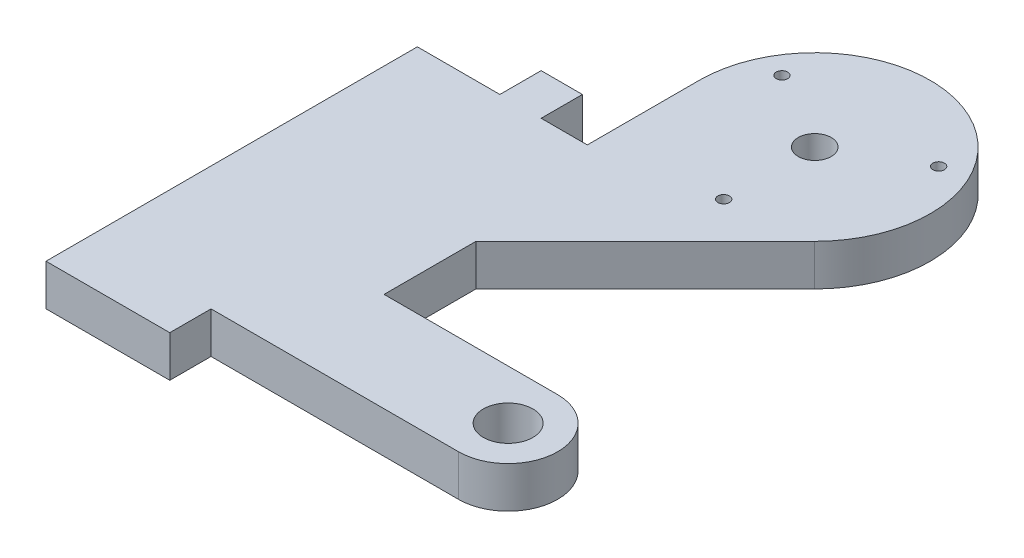
ISO-10303-21;
HEADER;
FILE_DESCRIPTION(('STEP AP214'),'2;1');
FILE_NAME('part.step','',(''),(''),'','','');
FILE_SCHEMA(('AUTOMOTIVE_DESIGN { 1 0 10303 214 1 1 1 1 }'));
ENDSEC;
DATA;
#1=APPLICATION_CONTEXT('core data for automotive mechanical design processes');
#2=APPLICATION_PROTOCOL_DEFINITION('international standard','automotive_design',2000,#1);
#3=PRODUCT_CONTEXT('',#1,'mechanical');
#4=PRODUCT('Part','Part','',(#3));
#5=PRODUCT_RELATED_PRODUCT_CATEGORY('part','',(#4));
#6=PRODUCT_DEFINITION_FORMATION('','',#4);
#7=PRODUCT_DEFINITION_CONTEXT('part definition',#1,'design');
#8=PRODUCT_DEFINITION('design','',#6,#7);
#9=PRODUCT_DEFINITION_SHAPE('','',#8);
#10=(LENGTH_UNIT() NAMED_UNIT(*) SI_UNIT(.MILLI.,.METRE.));
#11=(NAMED_UNIT(*) PLANE_ANGLE_UNIT() SI_UNIT($,.RADIAN.));
#12=(NAMED_UNIT(*) SI_UNIT($,.STERADIAN.) SOLID_ANGLE_UNIT());
#13=UNCERTAINTY_MEASURE_WITH_UNIT(LENGTH_MEASURE(1.E-05),#10,'distance_accuracy_value','');
#14=(GEOMETRIC_REPRESENTATION_CONTEXT(3) GLOBAL_UNCERTAINTY_ASSIGNED_CONTEXT((#13)) GLOBAL_UNIT_ASSIGNED_CONTEXT((#10,
#11,#12)) REPRESENTATION_CONTEXT('',''));
#15=CARTESIAN_POINT('',(0.,0.,0.));
#16=DIRECTION('',(0.,0.,1.));
#17=DIRECTION('',(1.,0.,0.));
#18=AXIS2_PLACEMENT_3D('',#15,#16,#17);
#19=CARTESIAN_POINT('',(34.5943867597462,5.,-53.5625469181819));
#20=DIRECTION('',(0.,-1.,0.));
#21=DIRECTION('',(0.,0.,-1.));
#22=AXIS2_PLACEMENT_3D('',#19,#20,#21);
#23=CYLINDRICAL_SURFACE('',#22,14.);
#24=CARTESIAN_POINT('',(34.5943867597462,0.,-53.5625469181819));
#25=DIRECTION('',(0.,1.,0.));
#26=DIRECTION('',(0.,0.,1.));
#27=AXIS2_PLACEMENT_3D('',#24,#25,#26);
#28=CIRCLE('',#27,14.);
#29=CARTESIAN_POINT('',(44.4938816963578,0.,-43.6630519815702));
#30=VERTEX_POINT('',#29);
#31=CARTESIAN_POINT('',(20.5943867597462,0.,-53.5625469181819));
#32=VERTEX_POINT('',#31);
#33=EDGE_CURVE('E207',#30,#32,#28,.T.);
#34=ORIENTED_EDGE('',*,*,#33,.T.);
#35=DIRECTION('',(0.,-1.,0.));
#36=VECTOR('',#35,1.);
#37=CARTESIAN_POINT('',(20.5943867597462,5.,-53.5625469181819));
#38=LINE('',#37,#36);
#39=CARTESIAN_POINT('',(20.5943867597462,5.,-53.5625469181819));
#40=VERTEX_POINT('',#39);
#41=EDGE_CURVE('E11',#40,#32,#38,.T.);
#42=ORIENTED_EDGE('',*,*,#41,.F.);
#43=CARTESIAN_POINT('',(34.5943867597462,5.,-53.5625469181819));
#44=DIRECTION('',(0.,1.,0.));
#45=DIRECTION('',(0.,0.,1.));
#46=AXIS2_PLACEMENT_3D('',#43,#44,#45);
#47=CIRCLE('',#46,14.);
#48=CARTESIAN_POINT('',(44.4938816963578,5.,-43.6630519815702));
#49=VERTEX_POINT('',#48);
#50=EDGE_CURVE('E353',#49,#40,#47,.T.);
#51=ORIENTED_EDGE('',*,*,#50,.F.);
#52=DIRECTION('',(0.,-1.,0.));
#53=VECTOR('',#52,1.);
#54=CARTESIAN_POINT('',(44.4938816963578,5.,-43.6630519815702));
#55=LINE('',#54,#53);
#56=EDGE_CURVE('E59',#49,#30,#55,.T.);
#57=ORIENTED_EDGE('',*,*,#56,.T.);
#58=EDGE_LOOP('',(#34,#42,#51,#57));
#59=FACE_BOUND('',#58,.T.);
#60=ADVANCED_FACE('F41',(#59),#23,.T.);
#61=CARTESIAN_POINT('',(20.5943867597462,5.,0.));
#62=DIRECTION('',(1.,0.,0.));
#63=DIRECTION('',(0.,0.,-1.));
#64=AXIS2_PLACEMENT_3D('',#61,#62,#63);
#65=PLANE('',#64);
#66=DIRECTION('',(0.,0.,1.));
#67=VECTOR('',#66,1.);
#68=CARTESIAN_POINT('',(20.5943867597462,0.,0.));
#69=LINE('',#68,#67);
#70=CARTESIAN_POINT('',(20.5943867597462,0.,-40.));
#71=VERTEX_POINT('',#70);
#72=EDGE_CURVE('E210',#32,#71,#69,.T.);
#73=ORIENTED_EDGE('',*,*,#72,.T.);
#74=DIRECTION('',(0.,-1.,0.));
#75=VECTOR('',#74,1.);
#76=CARTESIAN_POINT('',(20.5943867597462,5.,-40.));
#77=LINE('',#76,#75);
#78=CARTESIAN_POINT('',(20.5943867597462,5.,-40.));
#79=VERTEX_POINT('',#78);
#80=EDGE_CURVE('E51',#79,#71,#77,.T.);
#81=ORIENTED_EDGE('',*,*,#80,.F.);
#82=DIRECTION('',(0.,0.,1.));
#83=VECTOR('',#82,1.);
#84=CARTESIAN_POINT('',(20.5943867597462,5.,0.));
#85=LINE('',#84,#83);
#86=EDGE_CURVE('E119',#40,#79,#85,.T.);
#87=ORIENTED_EDGE('',*,*,#86,.F.);
#88=ORIENTED_EDGE('',*,*,#41,.T.);
#89=EDGE_LOOP('',(#73,#81,#87,#88));
#90=FACE_BOUND('',#89,.T.);
#91=ADVANCED_FACE('F303',(#90),#65,.F.);
#92=CARTESIAN_POINT('',(0.,5.,-40.));
#93=DIRECTION('',(0.,0.,-1.));
#94=DIRECTION('',(-1.,0.,0.));
#95=AXIS2_PLACEMENT_3D('',#92,#93,#94);
#96=PLANE('',#95);
#97=DIRECTION('',(1.,0.,0.));
#98=VECTOR('',#97,1.);
#99=CARTESIAN_POINT('',(0.,0.,-40.));
#100=LINE('',#99,#98);
#101=CARTESIAN_POINT('',(15.,0.,-40.));
#102=VERTEX_POINT('',#101);
#103=EDGE_CURVE('E214',#102,#71,#100,.T.);
#104=ORIENTED_EDGE('',*,*,#103,.F.);
#105=DIRECTION('',(0.,-1.,0.));
#106=VECTOR('',#105,1.);
#107=CARTESIAN_POINT('',(15.,5.,-40.));
#108=LINE('',#107,#106);
#109=CARTESIAN_POINT('',(15.,5.,-40.));
#110=VERTEX_POINT('',#109);
#111=EDGE_CURVE('E294',#110,#102,#108,.T.);
#112=ORIENTED_EDGE('',*,*,#111,.F.);
#113=DIRECTION('',(1.,0.,0.));
#114=VECTOR('',#113,1.);
#115=CARTESIAN_POINT('',(0.,5.,-40.));
#116=LINE('',#115,#114);
#117=EDGE_CURVE('E302',#110,#79,#116,.T.);
#118=ORIENTED_EDGE('',*,*,#117,.T.);
#119=ORIENTED_EDGE('',*,*,#80,.T.);
#120=EDGE_LOOP('',(#104,#112,#118,#119));
#121=FACE_BOUND('',#120,.T.);
#122=ADVANCED_FACE('F300',(#121),#96,.T.);
#123=CARTESIAN_POINT('',(15.,5.,0.));
#124=DIRECTION('',(-1.,0.,0.));
#125=DIRECTION('',(0.,0.,1.));
#126=AXIS2_PLACEMENT_3D('',#123,#124,#125);
#127=PLANE('',#126);
#128=DIRECTION('',(0.,0.,-1.));
#129=VECTOR('',#128,1.);
#130=CARTESIAN_POINT('',(15.,0.,0.));
#131=LINE('',#130,#129);
#132=CARTESIAN_POINT('',(15.,0.,-45.));
#133=VERTEX_POINT('',#132);
#134=EDGE_CURVE('E218',#102,#133,#131,.T.);
#135=ORIENTED_EDGE('',*,*,#134,.T.);
#136=DIRECTION('',(0.,-1.,0.));
#137=VECTOR('',#136,1.);
#138=CARTESIAN_POINT('',(15.,5.,-45.));
#139=LINE('',#138,#137);
#140=CARTESIAN_POINT('',(15.,5.,-45.));
#141=VERTEX_POINT('',#140);
#142=EDGE_CURVE('E290',#141,#133,#139,.T.);
#143=ORIENTED_EDGE('',*,*,#142,.F.);
#144=DIRECTION('',(0.,0.,-1.));
#145=VECTOR('',#144,1.);
#146=CARTESIAN_POINT('',(15.,5.,0.));
#147=LINE('',#146,#145);
#148=EDGE_CURVE('E323',#110,#141,#147,.T.);
#149=ORIENTED_EDGE('',*,*,#148,.F.);
#150=ORIENTED_EDGE('',*,*,#111,.T.);
#151=EDGE_LOOP('',(#135,#143,#149,#150));
#152=FACE_BOUND('',#151,.T.);
#153=ADVANCED_FACE('F312',(#152),#127,.F.);
#154=CARTESIAN_POINT('',(0.,5.,-45.));
#155=DIRECTION('',(0.,0.,1.));
#156=DIRECTION('',(1.,0.,0.));
#157=AXIS2_PLACEMENT_3D('',#154,#155,#156);
#158=PLANE('',#157);
#159=DIRECTION('',(-1.,0.,0.));
#160=VECTOR('',#159,1.);
#161=CARTESIAN_POINT('',(0.,0.,-45.));
#162=LINE('',#161,#160);
#163=CARTESIAN_POINT('',(9.99999999999999,0.,-45.));
#164=VERTEX_POINT('',#163);
#165=EDGE_CURVE('E222',#133,#164,#162,.T.);
#166=ORIENTED_EDGE('',*,*,#165,.T.);
#167=DIRECTION('',(0.,-1.,0.));
#168=VECTOR('',#167,1.);
#169=CARTESIAN_POINT('',(9.99999999999999,5.,-45.));
#170=LINE('',#169,#168);
#171=CARTESIAN_POINT('',(9.99999999999999,5.,-45.));
#172=VERTEX_POINT('',#171);
#173=EDGE_CURVE('E287',#172,#164,#170,.T.);
#174=ORIENTED_EDGE('',*,*,#173,.F.);
#175=DIRECTION('',(-1.,0.,0.));
#176=VECTOR('',#175,1.);
#177=CARTESIAN_POINT('',(0.,5.,-45.));
#178=LINE('',#177,#176);
#179=EDGE_CURVE('E318',#141,#172,#178,.T.);
#180=ORIENTED_EDGE('',*,*,#179,.F.);
#181=ORIENTED_EDGE('',*,*,#142,.T.);
#182=EDGE_LOOP('',(#166,#174,#180,#181));
#183=FACE_BOUND('',#182,.T.);
#184=ADVANCED_FACE('F316',(#183),#158,.F.);
#185=CARTESIAN_POINT('',(10.,5.,0.));
#186=DIRECTION('',(-1.,0.,0.));
#187=DIRECTION('',(0.,0.,1.));
#188=AXIS2_PLACEMENT_3D('',#185,#186,#187);
#189=PLANE('',#188);
#190=DIRECTION('',(0.,0.,-1.));
#191=VECTOR('',#190,1.);
#192=CARTESIAN_POINT('',(10.,0.,0.));
#193=LINE('',#192,#191);
#194=CARTESIAN_POINT('',(10.,0.,-40.));
#195=VERTEX_POINT('',#194);
#196=EDGE_CURVE('E226',#195,#164,#193,.T.);
#197=ORIENTED_EDGE('',*,*,#196,.F.);
#198=DIRECTION('',(0.,-1.,0.));
#199=VECTOR('',#198,1.);
#200=CARTESIAN_POINT('',(10.,5.,-40.));
#201=LINE('',#200,#199);
#202=CARTESIAN_POINT('',(10.,5.,-40.));
#203=VERTEX_POINT('',#202);
#204=EDGE_CURVE('E284',#203,#195,#201,.T.);
#205=ORIENTED_EDGE('',*,*,#204,.F.);
#206=DIRECTION('',(0.,0.,-1.));
#207=VECTOR('',#206,1.);
#208=CARTESIAN_POINT('',(10.,5.,0.));
#209=LINE('',#208,#207);
#210=EDGE_CURVE('E322',#203,#172,#209,.T.);
#211=ORIENTED_EDGE('',*,*,#210,.T.);
#212=ORIENTED_EDGE('',*,*,#173,.T.);
#213=EDGE_LOOP('',(#197,#205,#211,#212));
#214=FACE_BOUND('',#213,.T.);
#215=ADVANCED_FACE('F458',(#214),#189,.T.);
#216=CARTESIAN_POINT('',(0.,0.,-40.));
#217=VERTEX_POINT('',#216);
#218=EDGE_CURVE('E219',#217,#195,#100,.T.);
#219=ORIENTED_EDGE('',*,*,#218,.F.);
#220=DIRECTION('',(0.,-1.,0.));
#221=VECTOR('',#220,1.);
#222=CARTESIAN_POINT('',(0.,5.,-40.));
#223=LINE('',#222,#221);
#224=CARTESIAN_POINT('',(0.,5.,-40.));
#225=VERTEX_POINT('',#224);
#226=EDGE_CURVE('E281',#225,#217,#223,.T.);
#227=ORIENTED_EDGE('',*,*,#226,.F.);
#228=EDGE_CURVE('E327',#225,#203,#116,.T.);
#229=ORIENTED_EDGE('',*,*,#228,.T.);
#230=ORIENTED_EDGE('',*,*,#204,.T.);
#231=EDGE_LOOP('',(#219,#227,#229,#230));
#232=FACE_BOUND('',#231,.T.);
#233=ADVANCED_FACE('F454',(#232),#96,.T.);
#234=CARTESIAN_POINT('',(0.,5.,0.));
#235=DIRECTION('',(-1.,0.,0.));
#236=DIRECTION('',(0.,0.,1.));
#237=AXIS2_PLACEMENT_3D('',#234,#235,#236);
#238=PLANE('',#237);
#239=DIRECTION('',(0.,0.,-1.));
#240=VECTOR('',#239,1.);
#241=CARTESIAN_POINT('',(0.,0.,0.));
#242=LINE('',#241,#240);
#243=CARTESIAN_POINT('',(0.,0.,5.));
#244=VERTEX_POINT('',#243);
#245=EDGE_CURVE('E230',#244,#217,#242,.T.);
#246=ORIENTED_EDGE('',*,*,#245,.F.);
#247=DIRECTION('',(0.,-1.,0.));
#248=VECTOR('',#247,1.);
#249=CARTESIAN_POINT('',(0.,5.,5.));
#250=LINE('',#249,#248);
#251=CARTESIAN_POINT('',(0.,5.,5.));
#252=VERTEX_POINT('',#251);
#253=EDGE_CURVE('E278',#252,#244,#250,.T.);
#254=ORIENTED_EDGE('',*,*,#253,.F.);
#255=DIRECTION('',(0.,0.,-1.));
#256=VECTOR('',#255,1.);
#257=CARTESIAN_POINT('',(0.,5.,0.));
#258=LINE('',#257,#256);
#259=EDGE_CURVE('E332',#252,#225,#258,.T.);
#260=ORIENTED_EDGE('',*,*,#259,.T.);
#261=ORIENTED_EDGE('',*,*,#226,.T.);
#262=EDGE_LOOP('',(#246,#254,#260,#261));
#263=FACE_BOUND('',#262,.T.);
#264=ADVANCED_FACE('F450',(#263),#238,.T.);
#265=CARTESIAN_POINT('',(0.,5.,5.));
#266=DIRECTION('',(0.,0.,-1.));
#267=DIRECTION('',(-1.,0.,0.));
#268=AXIS2_PLACEMENT_3D('',#265,#266,#267);
#269=PLANE('',#268);
#270=DIRECTION('',(1.,0.,0.));
#271=VECTOR('',#270,1.);
#272=CARTESIAN_POINT('',(0.,0.,5.));
#273=LINE('',#272,#271);
#274=CARTESIAN_POINT('',(15.,0.,5.));
#275=VERTEX_POINT('',#274);
#276=EDGE_CURVE('E234',#244,#275,#273,.T.);
#277=ORIENTED_EDGE('',*,*,#276,.T.);
#278=DIRECTION('',(0.,-1.,0.));
#279=VECTOR('',#278,1.);
#280=CARTESIAN_POINT('',(15.,5.,5.));
#281=LINE('',#280,#279);
#282=CARTESIAN_POINT('',(15.,5.,5.));
#283=VERTEX_POINT('',#282);
#284=EDGE_CURVE('E275',#283,#275,#281,.T.);
#285=ORIENTED_EDGE('',*,*,#284,.F.);
#286=DIRECTION('',(1.,0.,0.));
#287=VECTOR('',#286,1.);
#288=CARTESIAN_POINT('',(0.,5.,5.));
#289=LINE('',#288,#287);
#290=EDGE_CURVE('E336',#252,#283,#289,.T.);
#291=ORIENTED_EDGE('',*,*,#290,.F.);
#292=ORIENTED_EDGE('',*,*,#253,.T.);
#293=EDGE_LOOP('',(#277,#285,#291,#292));
#294=FACE_BOUND('',#293,.T.);
#295=ADVANCED_FACE('F446',(#294),#269,.F.);
#296=CARTESIAN_POINT('',(15.,5.,0.));
#297=DIRECTION('',(1.,0.,0.));
#298=DIRECTION('',(0.,0.,-1.));
#299=AXIS2_PLACEMENT_3D('',#296,#297,#298);
#300=PLANE('',#299);
#301=DIRECTION('',(0.,0.,1.));
#302=VECTOR('',#301,1.);
#303=CARTESIAN_POINT('',(15.,0.,0.));
#304=LINE('',#303,#302);
#305=CARTESIAN_POINT('',(15.,0.,0.));
#306=VERTEX_POINT('',#305);
#307=EDGE_CURVE('E238',#306,#275,#304,.T.);
#308=ORIENTED_EDGE('',*,*,#307,.F.);
#309=DIRECTION('',(0.,-1.,0.));
#310=VECTOR('',#309,1.);
#311=CARTESIAN_POINT('',(15.,5.,0.));
#312=LINE('',#311,#310);
#313=CARTESIAN_POINT('',(15.,5.,0.));
#314=VERTEX_POINT('',#313);
#315=EDGE_CURVE('E272',#314,#306,#312,.T.);
#316=ORIENTED_EDGE('',*,*,#315,.F.);
#317=DIRECTION('',(0.,0.,1.));
#318=VECTOR('',#317,1.);
#319=CARTESIAN_POINT('',(15.,5.,0.));
#320=LINE('',#319,#318);
#321=EDGE_CURVE('E339',#314,#283,#320,.T.);
#322=ORIENTED_EDGE('',*,*,#321,.T.);
#323=ORIENTED_EDGE('',*,*,#284,.T.);
#324=EDGE_LOOP('',(#308,#316,#322,#323));
#325=FACE_BOUND('',#324,.T.);
#326=ADVANCED_FACE('F442',(#325),#300,.T.);
#327=CARTESIAN_POINT('',(0.,5.,0.));
#328=DIRECTION('',(0.,0.,-1.));
#329=DIRECTION('',(-1.,0.,0.));
#330=AXIS2_PLACEMENT_3D('',#327,#328,#329);
#331=PLANE('',#330);
#332=DIRECTION('',(1.,0.,0.));
#333=VECTOR('',#332,1.);
#334=CARTESIAN_POINT('',(0.,0.,0.));
#335=LINE('',#334,#333);
#336=CARTESIAN_POINT('',(45.,0.,0.));
#337=VERTEX_POINT('',#336);
#338=EDGE_CURVE('E242',#306,#337,#335,.T.);
#339=ORIENTED_EDGE('',*,*,#338,.T.);
#340=DIRECTION('',(0.,-1.,0.));
#341=VECTOR('',#340,1.);
#342=CARTESIAN_POINT('',(45.,5.,0.));
#343=LINE('',#342,#341);
#344=CARTESIAN_POINT('',(45.,5.,0.));
#345=VERTEX_POINT('',#344);
#346=EDGE_CURVE('E268',#345,#337,#343,.T.);
#347=ORIENTED_EDGE('',*,*,#346,.F.);
#348=DIRECTION('',(1.,0.,0.));
#349=VECTOR('',#348,1.);
#350=CARTESIAN_POINT('',(0.,5.,0.));
#351=LINE('',#350,#349);
#352=EDGE_CURVE('E343',#314,#345,#351,.T.);
#353=ORIENTED_EDGE('',*,*,#352,.F.);
#354=ORIENTED_EDGE('',*,*,#315,.T.);
#355=EDGE_LOOP('',(#339,#347,#353,#354));
#356=FACE_BOUND('',#355,.T.);
#357=ADVANCED_FACE('F438',(#356),#331,.F.);
#358=CARTESIAN_POINT('',(45.,5.,-6.));
#359=DIRECTION('',(0.,-1.,0.));
#360=DIRECTION('',(0.,0.,-1.));
#361=AXIS2_PLACEMENT_3D('',#358,#359,#360);
#362=CYLINDRICAL_SURFACE('',#361,6.);
#363=CARTESIAN_POINT('',(45.,0.,-6.));
#364=DIRECTION('',(0.,1.,0.));
#365=DIRECTION('',(0.,0.,1.));
#366=AXIS2_PLACEMENT_3D('',#363,#364,#365);
#367=CIRCLE('',#366,6.);
#368=CARTESIAN_POINT('',(45.,0.,-12.));
#369=VERTEX_POINT('',#368);
#370=EDGE_CURVE('E245',#337,#369,#367,.T.);
#371=ORIENTED_EDGE('',*,*,#370,.T.);
#372=DIRECTION('',(0.,-1.,0.));
#373=VECTOR('',#372,1.);
#374=CARTESIAN_POINT('',(45.,5.,-12.));
#375=LINE('',#374,#373);
#376=CARTESIAN_POINT('',(45.,5.,-12.));
#377=VERTEX_POINT('',#376);
#378=EDGE_CURVE('E177',#377,#369,#375,.T.);
#379=ORIENTED_EDGE('',*,*,#378,.F.);
#380=CARTESIAN_POINT('',(45.,5.,-6.));
#381=DIRECTION('',(0.,1.,0.));
#382=DIRECTION('',(0.,0.,1.));
#383=AXIS2_PLACEMENT_3D('',#380,#381,#382);
#384=CIRCLE('',#383,6.);
#385=EDGE_CURVE('E163',#345,#377,#384,.T.);
#386=ORIENTED_EDGE('',*,*,#385,.F.);
#387=ORIENTED_EDGE('',*,*,#346,.T.);
#388=EDGE_LOOP('',(#371,#379,#386,#387));
#389=FACE_BOUND('',#388,.T.);
#390=ADVANCED_FACE('F435',(#389),#362,.T.);
#391=CARTESIAN_POINT('',(0.,5.,-12.));
#392=DIRECTION('',(0.,0.,1.));
#393=DIRECTION('',(1.,0.,0.));
#394=AXIS2_PLACEMENT_3D('',#391,#392,#393);
#395=PLANE('',#394);
#396=DIRECTION('',(-1.,0.,0.));
#397=VECTOR('',#396,1.);
#398=CARTESIAN_POINT('',(0.,0.,-12.));
#399=LINE('',#398,#397);
#400=CARTESIAN_POINT('',(23.9647394168679,0.,-12.));
#401=VERTEX_POINT('',#400);
#402=EDGE_CURVE('E173',#369,#401,#399,.T.);
#403=ORIENTED_EDGE('',*,*,#402,.T.);
#404=DIRECTION('',(0.,-1.,0.));
#405=VECTOR('',#404,1.);
#406=CARTESIAN_POINT('',(23.9647394168679,5.,-12.));
#407=LINE('',#406,#405);
#408=CARTESIAN_POINT('',(23.9647394168679,5.,-12.));
#409=VERTEX_POINT('',#408);
#410=EDGE_CURVE('E170',#409,#401,#407,.T.);
#411=ORIENTED_EDGE('',*,*,#410,.F.);
#412=DIRECTION('',(-1.,0.,0.));
#413=VECTOR('',#412,1.);
#414=CARTESIAN_POINT('',(0.,5.,-12.));
#415=LINE('',#414,#413);
#416=EDGE_CURVE('E155',#377,#409,#415,.T.);
#417=ORIENTED_EDGE('',*,*,#416,.F.);
#418=ORIENTED_EDGE('',*,*,#378,.T.);
#419=EDGE_LOOP('',(#403,#411,#417,#418));
#420=FACE_BOUND('',#419,.T.);
#421=ADVANCED_FACE('F171',(#420),#395,.F.);
#422=CARTESIAN_POINT('',(23.9647394168679,5.,0.));
#423=DIRECTION('',(-1.,0.,0.));
#424=DIRECTION('',(0.,0.,1.));
#425=AXIS2_PLACEMENT_3D('',#422,#423,#424);
#426=PLANE('',#425);
#427=DIRECTION('',(0.,0.,-1.));
#428=VECTOR('',#427,1.);
#429=CARTESIAN_POINT('',(23.9647394168679,0.,0.));
#430=LINE('',#429,#428);
#431=CARTESIAN_POINT('',(23.9647394168679,0.,-23.1339097020804));
#432=VERTEX_POINT('',#431);
#433=EDGE_CURVE('E250',#401,#432,#430,.T.);
#434=ORIENTED_EDGE('',*,*,#433,.T.);
#435=DIRECTION('',(0.,-1.,0.));
#436=VECTOR('',#435,1.);
#437=CARTESIAN_POINT('',(23.9647394168679,5.,-23.1339097020804));
#438=LINE('',#437,#436);
#439=CARTESIAN_POINT('',(23.9647394168679,5.,-23.1339097020804));
#440=VERTEX_POINT('',#439);
#441=EDGE_CURVE('E107',#440,#432,#438,.T.);
#442=ORIENTED_EDGE('',*,*,#441,.F.);
#443=DIRECTION('',(0.,0.,-1.));
#444=VECTOR('',#443,1.);
#445=CARTESIAN_POINT('',(23.9647394168679,5.,0.));
#446=LINE('',#445,#444);
#447=EDGE_CURVE('E161',#409,#440,#446,.T.);
#448=ORIENTED_EDGE('',*,*,#447,.F.);
#449=ORIENTED_EDGE('',*,*,#410,.T.);
#450=EDGE_LOOP('',(#434,#442,#448,#449));
#451=FACE_BOUND('',#450,.T.);
#452=ADVANCED_FACE('F179',(#451),#426,.F.);
#453=CARTESIAN_POINT('',(0.415414857393735,5.,0.415414857393736));
#454=DIRECTION('',(0.707106781186546,0.,0.707106781186549));
#455=DIRECTION('',(0.707106781186549,0.,-0.707106781186546));
#456=AXIS2_PLACEMENT_3D('',#453,#454,#455);
#457=PLANE('',#456);
#458=DIRECTION('',(-0.707106781186549,0.,0.707106781186546));
#459=VECTOR('',#458,1.);
#460=CARTESIAN_POINT('',(0.415414857393735,0.,0.415414857393736));
#461=LINE('',#460,#459);
#462=EDGE_CURVE('E253',#30,#432,#461,.T.);
#463=ORIENTED_EDGE('',*,*,#462,.F.);
#464=ORIENTED_EDGE('',*,*,#56,.F.);
#465=DIRECTION('',(-0.707106781186549,0.,0.707106781186546));
#466=VECTOR('',#465,1.);
#467=CARTESIAN_POINT('',(0.415414857393735,5.,0.415414857393736));
#468=LINE('',#467,#466);
#469=EDGE_CURVE('E181',#49,#440,#468,.T.);
#470=ORIENTED_EDGE('',*,*,#469,.T.);
#471=ORIENTED_EDGE('',*,*,#441,.T.);
#472=EDGE_LOOP('',(#463,#464,#470,#471));
#473=FACE_BOUND('',#472,.T.);
#474=ADVANCED_FACE('F389',(#473),#457,.T.);
#475=CARTESIAN_POINT('',(44.1390993033221,5.,-59.0304955701449));
#476=DIRECTION('',(0.,-1.,0.));
#477=DIRECTION('',(0.,0.,-1.));
#478=AXIS2_PLACEMENT_3D('',#475,#476,#477);
#479=CYLINDRICAL_SURFACE('',#478,0.700000000000006);
#480=CARTESIAN_POINT('',(44.1390993033221,5.,-59.0304955701449));
#481=DIRECTION('',(0.,1.,0.));
#482=DIRECTION('',(0.,0.,1.));
#483=AXIS2_PLACEMENT_3D('',#480,#481,#482);
#484=CIRCLE('',#483,0.700000000000006);
#485=CARTESIAN_POINT('',(44.1390993033221,5.,-58.3304955701449));
#486=VERTEX_POINT('',#485);
#487=EDGE_CURVE('E355',#486,#486,#484,.T.);
#488=ORIENTED_EDGE('',*,*,#487,.T.);
#489=EDGE_LOOP('',(#488));
#490=FACE_BOUND('',#489,.T.);
#491=CARTESIAN_POINT('',(44.1390993033221,0.,-59.0304955701449));
#492=DIRECTION('',(0.,1.,0.));
#493=DIRECTION('',(0.,0.,1.));
#494=AXIS2_PLACEMENT_3D('',#491,#492,#493);
#495=CIRCLE('',#494,0.700000000000006);
#496=CARTESIAN_POINT('',(44.1390993033221,0.,-58.3304955701449));
#497=VERTEX_POINT('',#496);
#498=EDGE_CURVE('E203',#497,#497,#495,.T.);
#499=ORIENTED_EDGE('',*,*,#498,.F.);
#500=EDGE_LOOP('',(#499));
#501=FACE_BOUND('',#500,.T.);
#502=ADVANCED_FACE('F385',(#490,#501),#479,.F.);
#503=CARTESIAN_POINT('',(25.0866480487693,5.,-59.0945361267571));
#504=DIRECTION('',(0.,-1.,0.));
#505=DIRECTION('',(0.,0.,-1.));
#506=AXIS2_PLACEMENT_3D('',#503,#504,#505);
#507=CYLINDRICAL_SURFACE('',#506,0.700000000000004);
#508=CARTESIAN_POINT('',(25.0866480487693,5.,-59.0945361267571));
#509=DIRECTION('',(0.,1.,0.));
#510=DIRECTION('',(0.,0.,1.));
#511=AXIS2_PLACEMENT_3D('',#508,#509,#510);
#512=CIRCLE('',#511,0.700000000000004);
#513=CARTESIAN_POINT('',(25.0866480487693,5.,-58.3945361267571));
#514=VERTEX_POINT('',#513);
#515=EDGE_CURVE('E361',#514,#514,#512,.T.);
#516=ORIENTED_EDGE('',*,*,#515,.T.);
#517=EDGE_LOOP('',(#516));
#518=FACE_BOUND('',#517,.T.);
#519=CARTESIAN_POINT('',(25.0866480487693,0.,-59.0945361267571));
#520=DIRECTION('',(0.,1.,0.));
#521=DIRECTION('',(0.,0.,1.));
#522=AXIS2_PLACEMENT_3D('',#519,#520,#521);
#523=CIRCLE('',#522,0.700000000000004);
#524=CARTESIAN_POINT('',(25.0866480487693,0.,-58.3945361267571));
#525=VERTEX_POINT('',#524);
#526=EDGE_CURVE('E199',#525,#525,#523,.T.);
#527=ORIENTED_EDGE('',*,*,#526,.F.);
#528=EDGE_LOOP('',(#527));
#529=FACE_BOUND('',#528,.T.);
#530=ADVANCED_FACE('F388',(#518,#529),#507,.F.);
#531=CARTESIAN_POINT('',(34.5574129271471,5.,-42.5626090576436));
#532=DIRECTION('',(0.,-1.,0.));
#533=DIRECTION('',(0.,0.,-1.));
#534=AXIS2_PLACEMENT_3D('',#531,#532,#533);
#535=CYLINDRICAL_SURFACE('',#534,0.700000000000001);
#536=CARTESIAN_POINT('',(34.5574129271471,5.,-42.5626090576436));
#537=DIRECTION('',(0.,1.,0.));
#538=DIRECTION('',(0.,0.,1.));
#539=AXIS2_PLACEMENT_3D('',#536,#537,#538);
#540=CIRCLE('',#539,0.700000000000001);
#541=CARTESIAN_POINT('',(34.5574129271471,5.,-41.8626090576436));
#542=VERTEX_POINT('',#541);
#543=EDGE_CURVE('E365',#542,#542,#540,.T.);
#544=ORIENTED_EDGE('',*,*,#543,.T.);
#545=EDGE_LOOP('',(#544));
#546=FACE_BOUND('',#545,.T.);
#547=CARTESIAN_POINT('',(34.5574129271471,0.,-42.5626090576436));
#548=DIRECTION('',(0.,1.,0.));
#549=DIRECTION('',(0.,0.,1.));
#550=AXIS2_PLACEMENT_3D('',#547,#548,#549);
#551=CIRCLE('',#550,0.700000000000001);
#552=CARTESIAN_POINT('',(34.5574129271471,0.,-41.8626090576436));
#553=VERTEX_POINT('',#552);
#554=EDGE_CURVE('E195',#553,#553,#551,.T.);
#555=ORIENTED_EDGE('',*,*,#554,.F.);
#556=EDGE_LOOP('',(#555));
#557=FACE_BOUND('',#556,.T.);
#558=ADVANCED_FACE('F409',(#546,#557),#535,.F.);
#559=CARTESIAN_POINT('',(34.5943867597462,5.,-53.5625469181819));
#560=DIRECTION('',(0.,-1.,0.));
#561=DIRECTION('',(0.,0.,-1.));
#562=AXIS2_PLACEMENT_3D('',#559,#560,#561);
#563=CYLINDRICAL_SURFACE('',#562,2.);
#564=CARTESIAN_POINT('',(34.5943867597462,5.,-53.5625469181819));
#565=DIRECTION('',(0.,1.,0.));
#566=DIRECTION('',(0.,0.,1.));
#567=AXIS2_PLACEMENT_3D('',#564,#565,#566);
#568=CIRCLE('',#567,2.);
#569=CARTESIAN_POINT('',(34.5943867597462,5.,-51.5625469181819));
#570=VERTEX_POINT('',#569);
#571=EDGE_CURVE('E261',#570,#570,#568,.T.);
#572=ORIENTED_EDGE('',*,*,#571,.T.);
#573=EDGE_LOOP('',(#572));
#574=FACE_BOUND('',#573,.T.);
#575=CARTESIAN_POINT('',(34.5943867597462,0.,-53.5625469181819));
#576=DIRECTION('',(0.,1.,0.));
#577=DIRECTION('',(0.,0.,1.));
#578=AXIS2_PLACEMENT_3D('',#575,#576,#577);
#579=CIRCLE('',#578,2.);
#580=CARTESIAN_POINT('',(34.5943867597462,0.,-51.5625469181819));
#581=VERTEX_POINT('',#580);
#582=EDGE_CURVE('E191',#581,#581,#579,.T.);
#583=ORIENTED_EDGE('',*,*,#582,.F.);
#584=EDGE_LOOP('',(#583));
#585=FACE_BOUND('',#584,.T.);
#586=ADVANCED_FACE('F43',(#574,#585),#563,.F.);
#587=CARTESIAN_POINT('',(45.,5.,-6.));
#588=DIRECTION('',(0.,-1.,0.));
#589=DIRECTION('',(0.,0.,-1.));
#590=AXIS2_PLACEMENT_3D('',#587,#588,#589);
#591=CYLINDRICAL_SURFACE('',#590,3.);
#592=CARTESIAN_POINT('',(45.,5.,-6.));
#593=DIRECTION('',(0.,1.,0.));
#594=DIRECTION('',(0.,0.,1.));
#595=AXIS2_PLACEMENT_3D('',#592,#593,#594);
#596=CIRCLE('',#595,3.);
#597=CARTESIAN_POINT('',(45.,5.,-3.));
#598=VERTEX_POINT('',#597);
#599=EDGE_CURVE('E184',#598,#598,#596,.T.);
#600=ORIENTED_EDGE('',*,*,#599,.T.);
#601=EDGE_LOOP('',(#600));
#602=FACE_BOUND('',#601,.T.);
#603=CARTESIAN_POINT('',(45.,0.,-6.));
#604=DIRECTION('',(0.,1.,0.));
#605=DIRECTION('',(0.,0.,1.));
#606=AXIS2_PLACEMENT_3D('',#603,#604,#605);
#607=CIRCLE('',#606,3.);
#608=CARTESIAN_POINT('',(45.,0.,-3.));
#609=VERTEX_POINT('',#608);
#610=EDGE_CURVE('E257',#609,#609,#607,.T.);
#611=ORIENTED_EDGE('',*,*,#610,.F.);
#612=EDGE_LOOP('',(#611));
#613=FACE_BOUND('',#612,.T.);
#614=ADVANCED_FACE('F377',(#602,#613),#591,.F.);
#615=CARTESIAN_POINT('',(0.,5.,0.));
#616=DIRECTION('',(0.,1.,0.));
#617=DIRECTION('',(0.,0.,1.));
#618=AXIS2_PLACEMENT_3D('',#615,#616,#617);
#619=PLANE('',#618);
#620=ORIENTED_EDGE('',*,*,#571,.F.);
#621=EDGE_LOOP('',(#620));
#622=FACE_BOUND('',#621,.T.);
#623=ORIENTED_EDGE('',*,*,#543,.F.);
#624=EDGE_LOOP('',(#623));
#625=FACE_BOUND('',#624,.T.);
#626=ORIENTED_EDGE('',*,*,#515,.F.);
#627=EDGE_LOOP('',(#626));
#628=FACE_BOUND('',#627,.T.);
#629=ORIENTED_EDGE('',*,*,#487,.F.);
#630=EDGE_LOOP('',(#629));
#631=FACE_BOUND('',#630,.T.);
#632=ORIENTED_EDGE('',*,*,#50,.T.);
#633=ORIENTED_EDGE('',*,*,#86,.T.);
#634=ORIENTED_EDGE('',*,*,#117,.F.);
#635=ORIENTED_EDGE('',*,*,#148,.T.);
#636=ORIENTED_EDGE('',*,*,#179,.T.);
#637=ORIENTED_EDGE('',*,*,#210,.F.);
#638=ORIENTED_EDGE('',*,*,#228,.F.);
#639=ORIENTED_EDGE('',*,*,#259,.F.);
#640=ORIENTED_EDGE('',*,*,#290,.T.);
#641=ORIENTED_EDGE('',*,*,#321,.F.);
#642=ORIENTED_EDGE('',*,*,#352,.T.);
#643=ORIENTED_EDGE('',*,*,#385,.T.);
#644=ORIENTED_EDGE('',*,*,#416,.T.);
#645=ORIENTED_EDGE('',*,*,#447,.T.);
#646=ORIENTED_EDGE('',*,*,#469,.F.);
#647=EDGE_LOOP('',(#632,#633,#634,#635,#636,#637,#638,#639,#640,#641,#642,#643,#644,#645,#646));
#648=FACE_BOUND('',#647,.T.);
#649=ORIENTED_EDGE('',*,*,#599,.F.);
#650=EDGE_LOOP('',(#649));
#651=FACE_BOUND('',#650,.T.);
#652=ADVANCED_FACE('F157',(#622,#625,#628,#631,#648,#651),#619,.T.);
#653=CARTESIAN_POINT('',(0.,0.,0.));
#654=DIRECTION('',(0.,1.,0.));
#655=DIRECTION('',(0.,0.,1.));
#656=AXIS2_PLACEMENT_3D('',#653,#654,#655);
#657=PLANE('',#656);
#658=ORIENTED_EDGE('',*,*,#582,.T.);
#659=EDGE_LOOP('',(#658));
#660=FACE_BOUND('',#659,.T.);
#661=ORIENTED_EDGE('',*,*,#554,.T.);
#662=EDGE_LOOP('',(#661));
#663=FACE_BOUND('',#662,.T.);
#664=ORIENTED_EDGE('',*,*,#526,.T.);
#665=EDGE_LOOP('',(#664));
#666=FACE_BOUND('',#665,.T.);
#667=ORIENTED_EDGE('',*,*,#498,.T.);
#668=EDGE_LOOP('',(#667));
#669=FACE_BOUND('',#668,.T.);
#670=ORIENTED_EDGE('',*,*,#33,.F.);
#671=ORIENTED_EDGE('',*,*,#462,.T.);
#672=ORIENTED_EDGE('',*,*,#433,.F.);
#673=ORIENTED_EDGE('',*,*,#402,.F.);
#674=ORIENTED_EDGE('',*,*,#370,.F.);
#675=ORIENTED_EDGE('',*,*,#338,.F.);
#676=ORIENTED_EDGE('',*,*,#307,.T.);
#677=ORIENTED_EDGE('',*,*,#276,.F.);
#678=ORIENTED_EDGE('',*,*,#245,.T.);
#679=ORIENTED_EDGE('',*,*,#218,.T.);
#680=ORIENTED_EDGE('',*,*,#196,.T.);
#681=ORIENTED_EDGE('',*,*,#165,.F.);
#682=ORIENTED_EDGE('',*,*,#134,.F.);
#683=ORIENTED_EDGE('',*,*,#103,.T.);
#684=ORIENTED_EDGE('',*,*,#72,.F.);
#685=EDGE_LOOP('',(#670,#671,#672,#673,#674,#675,#676,#677,#678,#679,#680,#681,#682,#683,#684));
#686=FACE_BOUND('',#685,.T.);
#687=ORIENTED_EDGE('',*,*,#610,.T.);
#688=EDGE_LOOP('',(#687));
#689=FACE_BOUND('',#688,.T.);
#690=ADVANCED_FACE('F307',(#660,#663,#666,#669,#686,#689),#657,.F.);
#691=CLOSED_SHELL('',(#60,#91,#122,#153,#184,#215,#233,#264,#295,#326,#357,#390,#421,#452,#474,
#502,#530,#558,#586,#614,#652,#690));
#692=MANIFOLD_SOLID_BREP('B2',#691);
#693=ADVANCED_BREP_SHAPE_REPRESENTATION('',(#18,#692),#14);
#694=SHAPE_DEFINITION_REPRESENTATION(#9,#693);
ENDSEC;
END-ISO-10303-21;
